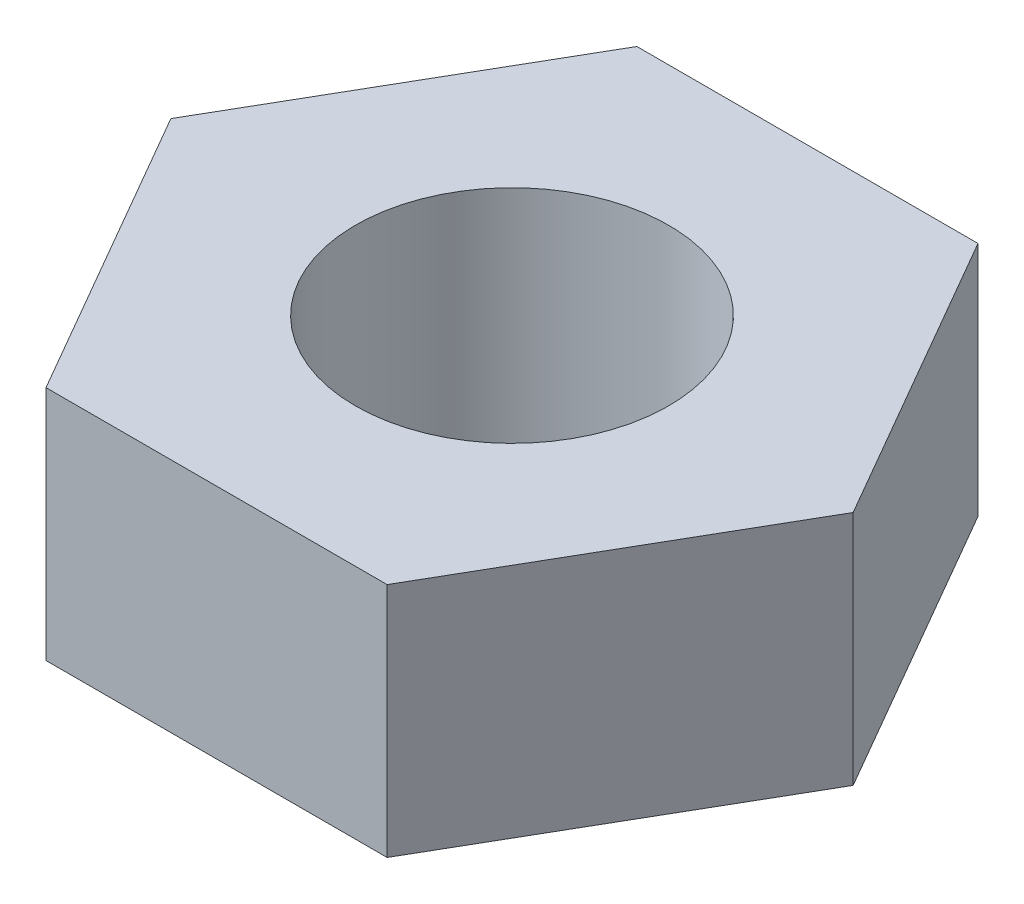
ISO-10303-21;
HEADER;
FILE_DESCRIPTION(('STEP AP214'),'2;1');
FILE_NAME('part.step','',(''),(''),'','','');
FILE_SCHEMA(('AUTOMOTIVE_DESIGN { 1 0 10303 214 1 1 1 1 }'));
ENDSEC;
DATA;
#1=APPLICATION_CONTEXT('core data for automotive mechanical design processes');
#2=APPLICATION_PROTOCOL_DEFINITION('international standard','automotive_design',2000,#1);
#3=PRODUCT_CONTEXT('',#1,'mechanical');
#4=PRODUCT('Part','Part','',(#3));
#5=PRODUCT_RELATED_PRODUCT_CATEGORY('part','',(#4));
#6=PRODUCT_DEFINITION_FORMATION('','',#4);
#7=PRODUCT_DEFINITION_CONTEXT('part definition',#1,'design');
#8=PRODUCT_DEFINITION('design','',#6,#7);
#9=PRODUCT_DEFINITION_SHAPE('','',#8);
#10=(LENGTH_UNIT() NAMED_UNIT(*) SI_UNIT(.MILLI.,.METRE.));
#11=(NAMED_UNIT(*) PLANE_ANGLE_UNIT() SI_UNIT($,.RADIAN.));
#12=(NAMED_UNIT(*) SI_UNIT($,.STERADIAN.) SOLID_ANGLE_UNIT());
#13=UNCERTAINTY_MEASURE_WITH_UNIT(LENGTH_MEASURE(1.E-05),#10,'distance_accuracy_value','');
#14=(GEOMETRIC_REPRESENTATION_CONTEXT(3) GLOBAL_UNCERTAINTY_ASSIGNED_CONTEXT((#13)) GLOBAL_UNIT_ASSIGNED_CONTEXT((#10,
#11,#12)) REPRESENTATION_CONTEXT('',''));
#15=CARTESIAN_POINT('',(0.,0.,0.));
#16=DIRECTION('',(0.,0.,1.));
#17=DIRECTION('',(1.,0.,0.));
#18=AXIS2_PLACEMENT_3D('',#15,#16,#17);
#19=CARTESIAN_POINT('',(0.,4.,0.));
#20=DIRECTION('',(0.,1.,0.));
#21=DIRECTION('',(0.,0.,1.));
#22=AXIS2_PLACEMENT_3D('',#19,#20,#21);
#23=PLANE('',#22);
#24=DIRECTION('',(-0.5,0.,-0.866025403784439));
#25=VECTOR('',#24,1.);
#26=CARTESIAN_POINT('',(5.77350269189626,4.,0.));
#27=LINE('',#26,#25);
#28=CARTESIAN_POINT('',(5.77350269189626,4.,0.));
#29=VERTEX_POINT('',#28);
#30=CARTESIAN_POINT('',(2.88675134594813,4.,-5.));
#31=VERTEX_POINT('',#30);
#32=EDGE_CURVE('E150',#29,#31,#27,.T.);
#33=ORIENTED_EDGE('',*,*,#32,.T.);
#34=DIRECTION('',(-1.,0.,0.));
#35=VECTOR('',#34,1.);
#36=CARTESIAN_POINT('',(2.88675134594813,4.,-5.));
#37=LINE('',#36,#35);
#38=CARTESIAN_POINT('',(-2.88675134594813,4.,-5.));
#39=VERTEX_POINT('',#38);
#40=EDGE_CURVE('E98',#31,#39,#37,.T.);
#41=ORIENTED_EDGE('',*,*,#40,.T.);
#42=DIRECTION('',(-0.5,0.,0.866025403784439));
#43=VECTOR('',#42,1.);
#44=CARTESIAN_POINT('',(-2.88675134594813,4.,-5.));
#45=LINE('',#44,#43);
#46=CARTESIAN_POINT('',(-5.77350269189626,4.,0.));
#47=VERTEX_POINT('',#46);
#48=EDGE_CURVE('E111',#39,#47,#45,.T.);
#49=ORIENTED_EDGE('',*,*,#48,.T.);
#50=DIRECTION('',(0.5,0.,0.866025403784439));
#51=VECTOR('',#50,1.);
#52=CARTESIAN_POINT('',(-5.77350269189626,4.,0.));
#53=LINE('',#52,#51);
#54=CARTESIAN_POINT('',(-2.88675134594813,4.,5.));
#55=VERTEX_POINT('',#54);
#56=EDGE_CURVE('E105',#47,#55,#53,.T.);
#57=ORIENTED_EDGE('',*,*,#56,.T.);
#58=DIRECTION('',(1.,0.,0.));
#59=VECTOR('',#58,1.);
#60=CARTESIAN_POINT('',(-2.88675134594813,4.,5.));
#61=LINE('',#60,#59);
#62=CARTESIAN_POINT('',(2.88675134594813,4.,5.));
#63=VERTEX_POINT('',#62);
#64=EDGE_CURVE('E109',#55,#63,#61,.T.);
#65=ORIENTED_EDGE('',*,*,#64,.T.);
#66=DIRECTION('',(0.5,0.,-0.866025403784438));
#67=VECTOR('',#66,1.);
#68=CARTESIAN_POINT('',(2.88675134594813,4.,5.));
#69=LINE('',#68,#67);
#70=EDGE_CURVE('E61',#63,#29,#69,.T.);
#71=ORIENTED_EDGE('',*,*,#70,.T.);
#72=EDGE_LOOP('',(#33,#41,#49,#57,#65,#71));
#73=FACE_BOUND('',#72,.T.);
#74=CARTESIAN_POINT('',(0.,4.,0.));
#75=DIRECTION('',(0.,1.,0.));
#76=DIRECTION('',(0.,0.,1.));
#77=AXIS2_PLACEMENT_3D('',#74,#75,#76);
#78=CIRCLE('',#77,2.65);
#79=CARTESIAN_POINT('',(0.,4.,2.65));
#80=VERTEX_POINT('',#79);
#81=EDGE_CURVE('E138',#80,#80,#78,.T.);
#82=ORIENTED_EDGE('',*,*,#81,.F.);
#83=EDGE_LOOP('',(#82));
#84=FACE_BOUND('',#83,.T.);
#85=ADVANCED_FACE('F43',(#73,#84),#23,.T.);
#86=CARTESIAN_POINT('',(0.,0.,0.));
#87=DIRECTION('',(0.,1.,0.));
#88=DIRECTION('',(0.,0.,1.));
#89=AXIS2_PLACEMENT_3D('',#86,#87,#88);
#90=PLANE('',#89);
#91=DIRECTION('',(-0.5,0.,-0.866025403784439));
#92=VECTOR('',#91,1.);
#93=CARTESIAN_POINT('',(5.77350269189626,0.,0.));
#94=LINE('',#93,#92);
#95=CARTESIAN_POINT('',(5.77350269189626,0.,0.));
#96=VERTEX_POINT('',#95);
#97=CARTESIAN_POINT('',(2.88675134594813,0.,-5.));
#98=VERTEX_POINT('',#97);
#99=EDGE_CURVE('E133',#96,#98,#94,.T.);
#100=ORIENTED_EDGE('',*,*,#99,.F.);
#101=DIRECTION('',(0.5,0.,-0.866025403784438));
#102=VECTOR('',#101,1.);
#103=CARTESIAN_POINT('',(2.88675134594813,0.,5.));
#104=LINE('',#103,#102);
#105=CARTESIAN_POINT('',(2.88675134594813,0.,5.));
#106=VERTEX_POINT('',#105);
#107=EDGE_CURVE('E90',#106,#96,#104,.T.);
#108=ORIENTED_EDGE('',*,*,#107,.F.);
#109=DIRECTION('',(1.,0.,0.));
#110=VECTOR('',#109,1.);
#111=CARTESIAN_POINT('',(-2.88675134594813,0.,5.));
#112=LINE('',#111,#110);
#113=CARTESIAN_POINT('',(-2.88675134594813,0.,5.));
#114=VERTEX_POINT('',#113);
#115=EDGE_CURVE('E84',#114,#106,#112,.T.);
#116=ORIENTED_EDGE('',*,*,#115,.F.);
#117=DIRECTION('',(0.5,0.,0.866025403784439));
#118=VECTOR('',#117,1.);
#119=CARTESIAN_POINT('',(-5.77350269189626,0.,0.));
#120=LINE('',#119,#118);
#121=CARTESIAN_POINT('',(-5.77350269189626,0.,0.));
#122=VERTEX_POINT('',#121);
#123=EDGE_CURVE('E120',#122,#114,#120,.T.);
#124=ORIENTED_EDGE('',*,*,#123,.F.);
#125=DIRECTION('',(-0.5,0.,0.866025403784439));
#126=VECTOR('',#125,1.);
#127=CARTESIAN_POINT('',(-2.88675134594813,0.,-5.));
#128=LINE('',#127,#126);
#129=CARTESIAN_POINT('',(-2.88675134594813,0.,-5.));
#130=VERTEX_POINT('',#129);
#131=EDGE_CURVE('E141',#130,#122,#128,.T.);
#132=ORIENTED_EDGE('',*,*,#131,.F.);
#133=DIRECTION('',(-1.,0.,0.));
#134=VECTOR('',#133,1.);
#135=CARTESIAN_POINT('',(2.88675134594813,0.,-5.));
#136=LINE('',#135,#134);
#137=EDGE_CURVE('E137',#98,#130,#136,.T.);
#138=ORIENTED_EDGE('',*,*,#137,.F.);
#139=EDGE_LOOP('',(#100,#108,#116,#124,#132,#138));
#140=FACE_BOUND('',#139,.T.);
#141=CARTESIAN_POINT('',(0.,0.,0.));
#142=DIRECTION('',(0.,1.,0.));
#143=DIRECTION('',(0.,0.,1.));
#144=AXIS2_PLACEMENT_3D('',#141,#142,#143);
#145=CIRCLE('',#144,2.65);
#146=CARTESIAN_POINT('',(0.,0.,2.65));
#147=VERTEX_POINT('',#146);
#148=EDGE_CURVE('E265',#147,#147,#145,.T.);
#149=ORIENTED_EDGE('',*,*,#148,.T.);
#150=EDGE_LOOP('',(#149));
#151=FACE_BOUND('',#150,.T.);
#152=ADVANCED_FACE('F163',(#140,#151),#90,.F.);
#153=CARTESIAN_POINT('',(5.77350269189626,4.,0.));
#154=DIRECTION('',(-0.866025403784439,0.,0.5));
#155=DIRECTION('',(0.5,0.,0.866025403784439));
#156=AXIS2_PLACEMENT_3D('',#153,#154,#155);
#157=PLANE('',#156);
#158=ORIENTED_EDGE('',*,*,#99,.T.);
#159=DIRECTION('',(0.,-1.,0.));
#160=VECTOR('',#159,1.);
#161=CARTESIAN_POINT('',(2.88675134594813,4.,-5.));
#162=LINE('',#161,#160);
#163=EDGE_CURVE('E11',#31,#98,#162,.T.);
#164=ORIENTED_EDGE('',*,*,#163,.F.);
#165=ORIENTED_EDGE('',*,*,#32,.F.);
#166=DIRECTION('',(0.,-1.,0.));
#167=VECTOR('',#166,1.);
#168=CARTESIAN_POINT('',(5.77350269189626,4.,0.));
#169=LINE('',#168,#167);
#170=EDGE_CURVE('E129',#29,#96,#169,.T.);
#171=ORIENTED_EDGE('',*,*,#170,.T.);
#172=EDGE_LOOP('',(#158,#164,#165,#171));
#173=FACE_BOUND('',#172,.T.);
#174=ADVANCED_FACE('F45',(#173),#157,.F.);
#175=CARTESIAN_POINT('',(2.88675134594813,4.,-5.));
#176=DIRECTION('',(0.,0.,1.));
#177=DIRECTION('',(1.,0.,0.));
#178=AXIS2_PLACEMENT_3D('',#175,#176,#177);
#179=PLANE('',#178);
#180=ORIENTED_EDGE('',*,*,#137,.T.);
#181=DIRECTION('',(0.,-1.,0.));
#182=VECTOR('',#181,1.);
#183=CARTESIAN_POINT('',(-2.88675134594813,4.,-5.));
#184=LINE('',#183,#182);
#185=EDGE_CURVE('E53',#39,#130,#184,.T.);
#186=ORIENTED_EDGE('',*,*,#185,.F.);
#187=ORIENTED_EDGE('',*,*,#40,.F.);
#188=ORIENTED_EDGE('',*,*,#163,.T.);
#189=EDGE_LOOP('',(#180,#186,#187,#188));
#190=FACE_BOUND('',#189,.T.);
#191=ADVANCED_FACE('F188',(#190),#179,.F.);
#192=CARTESIAN_POINT('',(-2.88675134594813,4.,-5.));
#193=DIRECTION('',(0.866025403784439,0.,0.5));
#194=DIRECTION('',(0.5,0.,-0.866025403784439));
#195=AXIS2_PLACEMENT_3D('',#192,#193,#194);
#196=PLANE('',#195);
#197=ORIENTED_EDGE('',*,*,#131,.T.);
#198=DIRECTION('',(0.,-1.,0.));
#199=VECTOR('',#198,1.);
#200=CARTESIAN_POINT('',(-5.77350269189626,4.,0.));
#201=LINE('',#200,#199);
#202=EDGE_CURVE('E122',#47,#122,#201,.T.);
#203=ORIENTED_EDGE('',*,*,#202,.F.);
#204=ORIENTED_EDGE('',*,*,#48,.F.);
#205=ORIENTED_EDGE('',*,*,#185,.T.);
#206=EDGE_LOOP('',(#197,#203,#204,#205));
#207=FACE_BOUND('',#206,.T.);
#208=ADVANCED_FACE('F160',(#207),#196,.F.);
#209=CARTESIAN_POINT('',(-5.77350269189626,4.,0.));
#210=DIRECTION('',(0.866025403784439,0.,-0.5));
#211=DIRECTION('',(-0.5,0.,-0.866025403784439));
#212=AXIS2_PLACEMENT_3D('',#209,#210,#211);
#213=PLANE('',#212);
#214=ORIENTED_EDGE('',*,*,#123,.T.);
#215=DIRECTION('',(0.,-1.,0.));
#216=VECTOR('',#215,1.);
#217=CARTESIAN_POINT('',(-2.88675134594813,4.,5.));
#218=LINE('',#217,#216);
#219=EDGE_CURVE('E117',#55,#114,#218,.T.);
#220=ORIENTED_EDGE('',*,*,#219,.F.);
#221=ORIENTED_EDGE('',*,*,#56,.F.);
#222=ORIENTED_EDGE('',*,*,#202,.T.);
#223=EDGE_LOOP('',(#214,#220,#221,#222));
#224=FACE_BOUND('',#223,.T.);
#225=ADVANCED_FACE('F118',(#224),#213,.F.);
#226=CARTESIAN_POINT('',(-2.88675134594813,4.,5.));
#227=DIRECTION('',(0.,0.,-1.));
#228=DIRECTION('',(-1.,0.,0.));
#229=AXIS2_PLACEMENT_3D('',#226,#227,#228);
#230=PLANE('',#229);
#231=ORIENTED_EDGE('',*,*,#115,.T.);
#232=DIRECTION('',(0.,-1.,0.));
#233=VECTOR('',#232,1.);
#234=CARTESIAN_POINT('',(2.88675134594813,4.,5.));
#235=LINE('',#234,#233);
#236=EDGE_CURVE('E123',#63,#106,#235,.T.);
#237=ORIENTED_EDGE('',*,*,#236,.F.);
#238=ORIENTED_EDGE('',*,*,#64,.F.);
#239=ORIENTED_EDGE('',*,*,#219,.T.);
#240=EDGE_LOOP('',(#231,#237,#238,#239));
#241=FACE_BOUND('',#240,.T.);
#242=ADVANCED_FACE('F125',(#241),#230,.F.);
#243=CARTESIAN_POINT('',(2.88675134594813,4.,5.));
#244=DIRECTION('',(-0.866025403784439,0.,-0.5));
#245=DIRECTION('',(-0.5,0.,0.866025403784438));
#246=AXIS2_PLACEMENT_3D('',#243,#244,#245);
#247=PLANE('',#246);
#248=ORIENTED_EDGE('',*,*,#107,.T.);
#249=ORIENTED_EDGE('',*,*,#170,.F.);
#250=ORIENTED_EDGE('',*,*,#70,.F.);
#251=ORIENTED_EDGE('',*,*,#236,.T.);
#252=EDGE_LOOP('',(#248,#249,#250,#251));
#253=FACE_BOUND('',#252,.T.);
#254=ADVANCED_FACE('F168',(#253),#247,.F.);
#255=CARTESIAN_POINT('',(0.,4.,0.));
#256=DIRECTION('',(0.,-1.,0.));
#257=DIRECTION('',(0.,0.,-1.));
#258=AXIS2_PLACEMENT_3D('',#255,#256,#257);
#259=CYLINDRICAL_SURFACE('',#258,2.65);
#260=ORIENTED_EDGE('',*,*,#81,.T.);
#261=EDGE_LOOP('',(#260));
#262=FACE_BOUND('',#261,.T.);
#263=ORIENTED_EDGE('',*,*,#148,.F.);
#264=EDGE_LOOP('',(#263));
#265=FACE_BOUND('',#264,.T.);
#266=ADVANCED_FACE('F170',(#262,#265),#259,.F.);
#267=CLOSED_SHELL('',(#85,#152,#174,#191,#208,#225,#242,#254,#266));
#268=MANIFOLD_SOLID_BREP('B2',#267);
#269=ADVANCED_BREP_SHAPE_REPRESENTATION('',(#18,#268),#14);
#270=SHAPE_DEFINITION_REPRESENTATION(#9,#269);
ENDSEC;
END-ISO-10303-21;
